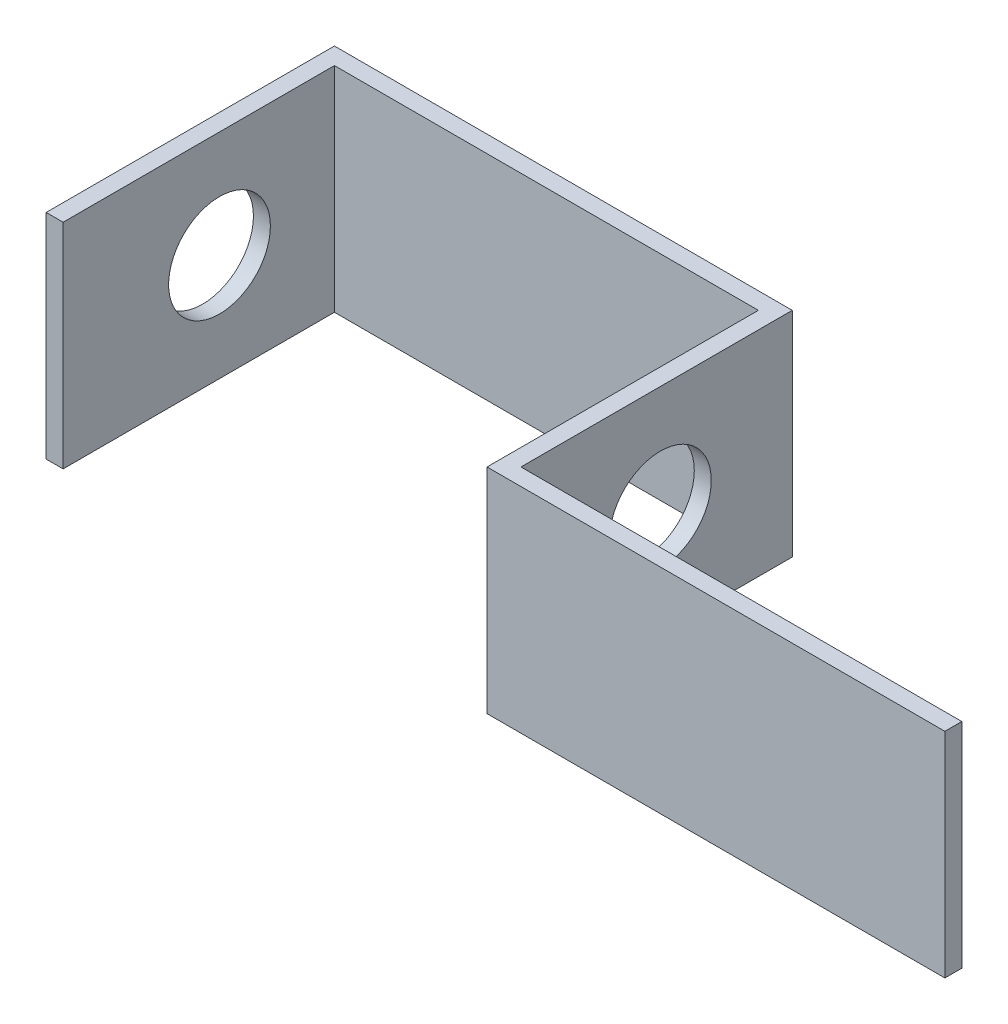
ISO-10303-21;
HEADER;
FILE_DESCRIPTION(('STEP AP214'),'2;1');
FILE_NAME('part.step','',(''),(''),'','','');
FILE_SCHEMA(('AUTOMOTIVE_DESIGN { 1 0 10303 214 1 1 1 1 }'));
ENDSEC;
DATA;
#1=APPLICATION_CONTEXT('core data for automotive mechanical design processes');
#2=APPLICATION_PROTOCOL_DEFINITION('international standard','automotive_design',2000,#1);
#3=PRODUCT_CONTEXT('',#1,'mechanical');
#4=PRODUCT('Part','Part','',(#3));
#5=PRODUCT_RELATED_PRODUCT_CATEGORY('part','',(#4));
#6=PRODUCT_DEFINITION_FORMATION('','',#4);
#7=PRODUCT_DEFINITION_CONTEXT('part definition',#1,'design');
#8=PRODUCT_DEFINITION('design','',#6,#7);
#9=PRODUCT_DEFINITION_SHAPE('','',#8);
#10=(LENGTH_UNIT() NAMED_UNIT(*) SI_UNIT(.MILLI.,.METRE.));
#11=(NAMED_UNIT(*) PLANE_ANGLE_UNIT() SI_UNIT($,.RADIAN.));
#12=(NAMED_UNIT(*) SI_UNIT($,.STERADIAN.) SOLID_ANGLE_UNIT());
#13=UNCERTAINTY_MEASURE_WITH_UNIT(LENGTH_MEASURE(1.E-05),#10,'distance_accuracy_value','');
#14=(GEOMETRIC_REPRESENTATION_CONTEXT(3) GLOBAL_UNCERTAINTY_ASSIGNED_CONTEXT((#13)) GLOBAL_UNIT_ASSIGNED_CONTEXT((#10,
#11,#12)) REPRESENTATION_CONTEXT('',''));
#15=CARTESIAN_POINT('',(0.,0.,0.));
#16=DIRECTION('',(0.,0.,1.));
#17=DIRECTION('',(1.,0.,0.));
#18=AXIS2_PLACEMENT_3D('',#15,#16,#17);
#19=CARTESIAN_POINT('',(-85.725,80.01,6.35000000000002));
#20=DIRECTION('',(1.,0.,0.));
#21=DIRECTION('',(0.,0.,-1.));
#22=AXIS2_PLACEMENT_3D('',#19,#20,#21);
#23=PLANE('',#22);
#24=CARTESIAN_POINT('',(-85.725,40.0049999999999,-52.2149045313785));
#25=DIRECTION('',(1.,0.,0.));
#26=DIRECTION('',(0.,0.,-1.));
#27=AXIS2_PLACEMENT_3D('',#24,#25,#26);
#28=CIRCLE('',#27,19.05);
#29=CARTESIAN_POINT('',(-85.725,40.0049999999999,-71.2649045313785));
#30=VERTEX_POINT('',#29);
#31=EDGE_CURVE('E151',#30,#30,#28,.T.);
#32=ORIENTED_EDGE('',*,*,#31,.T.);
#33=EDGE_LOOP('',(#32));
#34=FACE_BOUND('',#33,.T.);
#35=DIRECTION('',(0.,0.,1.));
#36=VECTOR('',#35,1.);
#37=CARTESIAN_POINT('',(-85.725,0.,6.35000000000002));
#38=LINE('',#37,#36);
#39=CARTESIAN_POINT('',(-85.725,0.,-101.6));
#40=VERTEX_POINT('',#39);
#41=CARTESIAN_POINT('',(-85.725,0.,6.35000000000002));
#42=VERTEX_POINT('',#41);
#43=EDGE_CURVE('E147',#40,#42,#38,.T.);
#44=ORIENTED_EDGE('',*,*,#43,.T.);
#45=DIRECTION('',(0.,-1.,0.));
#46=VECTOR('',#45,1.);
#47=CARTESIAN_POINT('',(-85.725,80.01,6.35000000000002));
#48=LINE('',#47,#46);
#49=CARTESIAN_POINT('',(-85.725,80.01,6.35000000000002));
#50=VERTEX_POINT('',#49);
#51=EDGE_CURVE('E11',#50,#42,#48,.T.);
#52=ORIENTED_EDGE('',*,*,#51,.F.);
#53=DIRECTION('',(0.,0.,1.));
#54=VECTOR('',#53,1.);
#55=CARTESIAN_POINT('',(-85.725,80.01,6.35000000000002));
#56=LINE('',#55,#54);
#57=CARTESIAN_POINT('',(-85.725,80.01,-101.6));
#58=VERTEX_POINT('',#57);
#59=EDGE_CURVE('E167',#58,#50,#56,.T.);
#60=ORIENTED_EDGE('',*,*,#59,.F.);
#61=DIRECTION('',(0.,-1.,0.));
#62=VECTOR('',#61,1.);
#63=CARTESIAN_POINT('',(-85.725,80.01,-101.6));
#64=LINE('',#63,#62);
#65=EDGE_CURVE('E143',#58,#40,#64,.T.);
#66=ORIENTED_EDGE('',*,*,#65,.T.);
#67=EDGE_LOOP('',(#44,#52,#60,#66));
#68=FACE_BOUND('',#67,.T.);
#69=ADVANCED_FACE('F39',(#34,#68),#23,.F.);
#70=CARTESIAN_POINT('',(-79.375,80.01,6.35000000000002));
#71=DIRECTION('',(0.,0.,-1.));
#72=DIRECTION('',(-1.,0.,0.));
#73=AXIS2_PLACEMENT_3D('',#70,#71,#72);
#74=PLANE('',#73);
#75=DIRECTION('',(1.,0.,0.));
#76=VECTOR('',#75,1.);
#77=CARTESIAN_POINT('',(-79.375,0.,6.35000000000002));
#78=LINE('',#77,#76);
#79=CARTESIAN_POINT('',(-79.375,0.,6.35000000000002));
#80=VERTEX_POINT('',#79);
#81=EDGE_CURVE('E150',#42,#80,#78,.T.);
#82=ORIENTED_EDGE('',*,*,#81,.T.);
#83=DIRECTION('',(0.,-1.,0.));
#84=VECTOR('',#83,1.);
#85=CARTESIAN_POINT('',(-79.375,80.01,6.35000000000002));
#86=LINE('',#85,#84);
#87=CARTESIAN_POINT('',(-79.375,80.01,6.35000000000002));
#88=VERTEX_POINT('',#87);
#89=EDGE_CURVE('E47',#88,#80,#86,.T.);
#90=ORIENTED_EDGE('',*,*,#89,.F.);
#91=DIRECTION('',(1.,0.,0.));
#92=VECTOR('',#91,1.);
#93=CARTESIAN_POINT('',(-79.375,80.01,6.35000000000002));
#94=LINE('',#93,#92);
#95=EDGE_CURVE('E104',#50,#88,#94,.T.);
#96=ORIENTED_EDGE('',*,*,#95,.F.);
#97=ORIENTED_EDGE('',*,*,#51,.T.);
#98=EDGE_LOOP('',(#82,#90,#96,#97));
#99=FACE_BOUND('',#98,.T.);
#100=ADVANCED_FACE('F241',(#99),#74,.F.);
#101=CARTESIAN_POINT('',(-79.375,80.01,-95.25));
#102=DIRECTION('',(-1.,0.,0.));
#103=DIRECTION('',(0.,0.,1.));
#104=AXIS2_PLACEMENT_3D('',#101,#102,#103);
#105=PLANE('',#104);
#106=CARTESIAN_POINT('',(-79.375,40.0049999999999,-52.2149045313785));
#107=DIRECTION('',(-1.,0.,0.));
#108=DIRECTION('',(0.,0.,1.));
#109=AXIS2_PLACEMENT_3D('',#106,#107,#108);
#110=CIRCLE('',#109,19.05);
#111=CARTESIAN_POINT('',(-79.375,40.0049999999999,-71.2649045313785));
#112=VERTEX_POINT('',#111);
#113=EDGE_CURVE('E215',#112,#112,#110,.T.);
#114=ORIENTED_EDGE('',*,*,#113,.T.);
#115=EDGE_LOOP('',(#114));
#116=FACE_BOUND('',#115,.T.);
#117=DIRECTION('',(0.,0.,-1.));
#118=VECTOR('',#117,1.);
#119=CARTESIAN_POINT('',(-79.375,0.,-95.25));
#120=LINE('',#119,#118);
#121=CARTESIAN_POINT('',(-79.375,0.,-95.25));
#122=VERTEX_POINT('',#121);
#123=EDGE_CURVE('E153',#80,#122,#120,.T.);
#124=ORIENTED_EDGE('',*,*,#123,.T.);
#125=DIRECTION('',(0.,-1.,0.));
#126=VECTOR('',#125,1.);
#127=CARTESIAN_POINT('',(-79.375,80.01,-95.25));
#128=LINE('',#127,#126);
#129=CARTESIAN_POINT('',(-79.375,80.01,-95.25));
#130=VERTEX_POINT('',#129);
#131=EDGE_CURVE('E180',#130,#122,#128,.T.);
#132=ORIENTED_EDGE('',*,*,#131,.F.);
#133=DIRECTION('',(0.,0.,-1.));
#134=VECTOR('',#133,1.);
#135=CARTESIAN_POINT('',(-79.375,80.01,-95.25));
#136=LINE('',#135,#134);
#137=EDGE_CURVE('E188',#88,#130,#136,.T.);
#138=ORIENTED_EDGE('',*,*,#137,.F.);
#139=ORIENTED_EDGE('',*,*,#89,.T.);
#140=EDGE_LOOP('',(#124,#132,#138,#139));
#141=FACE_BOUND('',#140,.T.);
#142=ADVANCED_FACE('F186',(#116,#141),#105,.F.);
#143=CARTESIAN_POINT('',(79.375,80.01,-95.25));
#144=DIRECTION('',(0.,0.,-1.));
#145=DIRECTION('',(-1.,0.,0.));
#146=AXIS2_PLACEMENT_3D('',#143,#144,#145);
#147=PLANE('',#146);
#148=DIRECTION('',(1.,0.,0.));
#149=VECTOR('',#148,1.);
#150=CARTESIAN_POINT('',(79.375,0.,-95.25));
#151=LINE('',#150,#149);
#152=CARTESIAN_POINT('',(79.375,0.,-95.25));
#153=VERTEX_POINT('',#152);
#154=EDGE_CURVE('E155',#122,#153,#151,.T.);
#155=ORIENTED_EDGE('',*,*,#154,.T.);
#156=DIRECTION('',(0.,-1.,0.));
#157=VECTOR('',#156,1.);
#158=CARTESIAN_POINT('',(79.375,80.01,-95.25));
#159=LINE('',#158,#157);
#160=CARTESIAN_POINT('',(79.375,80.01,-95.25));
#161=VERTEX_POINT('',#160);
#162=EDGE_CURVE('E177',#161,#153,#159,.T.);
#163=ORIENTED_EDGE('',*,*,#162,.F.);
#164=DIRECTION('',(1.,0.,0.));
#165=VECTOR('',#164,1.);
#166=CARTESIAN_POINT('',(79.375,80.01,-95.25));
#167=LINE('',#166,#165);
#168=EDGE_CURVE('E205',#130,#161,#167,.T.);
#169=ORIENTED_EDGE('',*,*,#168,.F.);
#170=ORIENTED_EDGE('',*,*,#131,.T.);
#171=EDGE_LOOP('',(#155,#163,#169,#170));
#172=FACE_BOUND('',#171,.T.);
#173=ADVANCED_FACE('F196',(#172),#147,.F.);
#174=CARTESIAN_POINT('',(79.375,80.01,-95.25));
#175=DIRECTION('',(1.,0.,0.));
#176=DIRECTION('',(0.,0.,-1.));
#177=AXIS2_PLACEMENT_3D('',#174,#175,#176);
#178=PLANE('',#177);
#179=CARTESIAN_POINT('',(79.375,40.0049999999999,-52.2149045313785));
#180=DIRECTION('',(1.,0.,0.));
#181=DIRECTION('',(0.,0.,-1.));
#182=AXIS2_PLACEMENT_3D('',#179,#180,#181);
#183=CIRCLE('',#182,19.05);
#184=CARTESIAN_POINT('',(79.3749999999999,40.0049999999999,-71.2649045313785));
#185=VERTEX_POINT('',#184);
#186=EDGE_CURVE('E218',#185,#185,#183,.T.);
#187=ORIENTED_EDGE('',*,*,#186,.T.);
#188=EDGE_LOOP('',(#187));
#189=FACE_BOUND('',#188,.T.);
#190=DIRECTION('',(0.,0.,1.));
#191=VECTOR('',#190,1.);
#192=CARTESIAN_POINT('',(79.375,0.,-95.25));
#193=LINE('',#192,#191);
#194=CARTESIAN_POINT('',(79.375,0.,6.35));
#195=VERTEX_POINT('',#194);
#196=EDGE_CURVE('E157',#153,#195,#193,.T.);
#197=ORIENTED_EDGE('',*,*,#196,.T.);
#198=DIRECTION('',(0.,-1.,0.));
#199=VECTOR('',#198,1.);
#200=CARTESIAN_POINT('',(79.375,80.01,6.35));
#201=LINE('',#200,#199);
#202=CARTESIAN_POINT('',(79.375,80.01,6.35));
#203=VERTEX_POINT('',#202);
#204=EDGE_CURVE('E174',#203,#195,#201,.T.);
#205=ORIENTED_EDGE('',*,*,#204,.F.);
#206=DIRECTION('',(0.,0.,1.));
#207=VECTOR('',#206,1.);
#208=CARTESIAN_POINT('',(79.375,80.01,-95.25));
#209=LINE('',#208,#207);
#210=EDGE_CURVE('E202',#161,#203,#209,.T.);
#211=ORIENTED_EDGE('',*,*,#210,.F.);
#212=ORIENTED_EDGE('',*,*,#162,.T.);
#213=EDGE_LOOP('',(#197,#205,#211,#212));
#214=FACE_BOUND('',#213,.T.);
#215=ADVANCED_FACE('F200',(#189,#214),#178,.F.);
#216=CARTESIAN_POINT('',(110.088132220091,80.01,6.34999999999999));
#217=DIRECTION('',(0.,0.,-1.));
#218=DIRECTION('',(-1.,0.,0.));
#219=AXIS2_PLACEMENT_3D('',#216,#217,#218);
#220=PLANE('',#219);
#221=DIRECTION('',(1.,0.,0.));
#222=VECTOR('',#221,1.);
#223=CARTESIAN_POINT('',(110.088132220091,0.,6.34999999999999));
#224=LINE('',#223,#222);
#225=CARTESIAN_POINT('',(250.825,0.,6.34999999999999));
#226=VERTEX_POINT('',#225);
#227=EDGE_CURVE('E160',#195,#226,#224,.T.);
#228=ORIENTED_EDGE('',*,*,#227,.T.);
#229=DIRECTION('',(0.,-1.,0.));
#230=VECTOR('',#229,1.);
#231=CARTESIAN_POINT('',(250.825,80.01,6.34999999999999));
#232=LINE('',#231,#230);
#233=CARTESIAN_POINT('',(250.825,80.01,6.34999999999999));
#234=VERTEX_POINT('',#233);
#235=EDGE_CURVE('E171',#234,#226,#232,.T.);
#236=ORIENTED_EDGE('',*,*,#235,.F.);
#237=DIRECTION('',(1.,0.,0.));
#238=VECTOR('',#237,1.);
#239=CARTESIAN_POINT('',(110.088132220091,80.01,6.34999999999999));
#240=LINE('',#239,#238);
#241=EDGE_CURVE('E204',#203,#234,#240,.T.);
#242=ORIENTED_EDGE('',*,*,#241,.F.);
#243=ORIENTED_EDGE('',*,*,#204,.T.);
#244=EDGE_LOOP('',(#228,#236,#242,#243));
#245=FACE_BOUND('',#244,.T.);
#246=ADVANCED_FACE('F256',(#245),#220,.F.);
#247=CARTESIAN_POINT('',(250.825,80.01,6.34999999999999));
#248=DIRECTION('',(-1.,0.,0.));
#249=DIRECTION('',(0.,0.,1.));
#250=AXIS2_PLACEMENT_3D('',#247,#248,#249);
#251=PLANE('',#250);
#252=DIRECTION('',(0.,0.,-1.));
#253=VECTOR('',#252,1.);
#254=CARTESIAN_POINT('',(250.825,0.,6.34999999999999));
#255=LINE('',#254,#253);
#256=CARTESIAN_POINT('',(250.825,0.,0.));
#257=VERTEX_POINT('',#256);
#258=EDGE_CURVE('E162',#226,#257,#255,.T.);
#259=ORIENTED_EDGE('',*,*,#258,.T.);
#260=DIRECTION('',(0.,-1.,0.));
#261=VECTOR('',#260,1.);
#262=CARTESIAN_POINT('',(250.825,80.01,0.));
#263=LINE('',#262,#261);
#264=CARTESIAN_POINT('',(250.825,80.01,0.));
#265=VERTEX_POINT('',#264);
#266=EDGE_CURVE('E138',#265,#257,#263,.T.);
#267=ORIENTED_EDGE('',*,*,#266,.F.);
#268=DIRECTION('',(0.,0.,-1.));
#269=VECTOR('',#268,1.);
#270=CARTESIAN_POINT('',(250.825,80.01,6.34999999999999));
#271=LINE('',#270,#269);
#272=EDGE_CURVE('E129',#234,#265,#271,.T.);
#273=ORIENTED_EDGE('',*,*,#272,.F.);
#274=ORIENTED_EDGE('',*,*,#235,.T.);
#275=EDGE_LOOP('',(#259,#267,#273,#274));
#276=FACE_BOUND('',#275,.T.);
#277=ADVANCED_FACE('F238',(#276),#251,.F.);
#278=CARTESIAN_POINT('',(250.825,80.01,0.));
#279=DIRECTION('',(0.,0.,1.));
#280=DIRECTION('',(1.,0.,0.));
#281=AXIS2_PLACEMENT_3D('',#278,#279,#280);
#282=PLANE('',#281);
#283=DIRECTION('',(-1.,0.,0.));
#284=VECTOR('',#283,1.);
#285=CARTESIAN_POINT('',(250.825,0.,0.));
#286=LINE('',#285,#284);
#287=CARTESIAN_POINT('',(85.725,0.,0.));
#288=VERTEX_POINT('',#287);
#289=EDGE_CURVE('E137',#257,#288,#286,.T.);
#290=ORIENTED_EDGE('',*,*,#289,.T.);
#291=DIRECTION('',(0.,-1.,0.));
#292=VECTOR('',#291,1.);
#293=CARTESIAN_POINT('',(85.725,80.01,0.));
#294=LINE('',#293,#292);
#295=CARTESIAN_POINT('',(85.725,80.01,0.));
#296=VERTEX_POINT('',#295);
#297=EDGE_CURVE('E134',#296,#288,#294,.T.);
#298=ORIENTED_EDGE('',*,*,#297,.F.);
#299=DIRECTION('',(-1.,0.,0.));
#300=VECTOR('',#299,1.);
#301=CARTESIAN_POINT('',(250.825,80.01,0.));
#302=LINE('',#301,#300);
#303=EDGE_CURVE('E123',#265,#296,#302,.T.);
#304=ORIENTED_EDGE('',*,*,#303,.F.);
#305=ORIENTED_EDGE('',*,*,#266,.T.);
#306=EDGE_LOOP('',(#290,#298,#304,#305));
#307=FACE_BOUND('',#306,.T.);
#308=ADVANCED_FACE('F135',(#307),#282,.F.);
#309=CARTESIAN_POINT('',(85.725,80.01,0.));
#310=DIRECTION('',(-1.,0.,0.));
#311=DIRECTION('',(0.,0.,1.));
#312=AXIS2_PLACEMENT_3D('',#309,#310,#311);
#313=PLANE('',#312);
#314=CARTESIAN_POINT('',(85.725,40.0049999999999,-52.2149045313785));
#315=DIRECTION('',(1.,0.,0.));
#316=DIRECTION('',(0.,0.,-1.));
#317=AXIS2_PLACEMENT_3D('',#314,#315,#316);
#318=CIRCLE('',#317,19.05);
#319=CARTESIAN_POINT('',(85.725,40.0049999999999,-71.2649045313785));
#320=VERTEX_POINT('',#319);
#321=EDGE_CURVE('E221',#320,#320,#318,.T.);
#322=ORIENTED_EDGE('',*,*,#321,.F.);
#323=EDGE_LOOP('',(#322));
#324=FACE_BOUND('',#323,.T.);
#325=DIRECTION('',(0.,0.,-1.));
#326=VECTOR('',#325,1.);
#327=CARTESIAN_POINT('',(85.725,0.,0.));
#328=LINE('',#327,#326);
#329=CARTESIAN_POINT('',(85.725,0.,-101.6));
#330=VERTEX_POINT('',#329);
#331=EDGE_CURVE('E90',#288,#330,#328,.T.);
#332=ORIENTED_EDGE('',*,*,#331,.T.);
#333=DIRECTION('',(0.,-1.,0.));
#334=VECTOR('',#333,1.);
#335=CARTESIAN_POINT('',(85.725,80.01,-101.6));
#336=LINE('',#335,#334);
#337=CARTESIAN_POINT('',(85.725,80.01,-101.6));
#338=VERTEX_POINT('',#337);
#339=EDGE_CURVE('E139',#338,#330,#336,.T.);
#340=ORIENTED_EDGE('',*,*,#339,.F.);
#341=DIRECTION('',(0.,0.,-1.));
#342=VECTOR('',#341,1.);
#343=CARTESIAN_POINT('',(85.725,80.01,0.));
#344=LINE('',#343,#342);
#345=EDGE_CURVE('E127',#296,#338,#344,.T.);
#346=ORIENTED_EDGE('',*,*,#345,.F.);
#347=ORIENTED_EDGE('',*,*,#297,.T.);
#348=EDGE_LOOP('',(#332,#340,#346,#347));
#349=FACE_BOUND('',#348,.T.);
#350=ADVANCED_FACE('F141',(#324,#349),#313,.F.);
#351=CARTESIAN_POINT('',(85.725,80.01,-101.6));
#352=DIRECTION('',(0.,0.,1.));
#353=DIRECTION('',(1.,0.,0.));
#354=AXIS2_PLACEMENT_3D('',#351,#352,#353);
#355=PLANE('',#354);
#356=DIRECTION('',(-1.,0.,0.));
#357=VECTOR('',#356,1.);
#358=CARTESIAN_POINT('',(85.725,0.,-101.6));
#359=LINE('',#358,#357);
#360=EDGE_CURVE('E96',#330,#40,#359,.T.);
#361=ORIENTED_EDGE('',*,*,#360,.T.);
#362=ORIENTED_EDGE('',*,*,#65,.F.);
#363=DIRECTION('',(-1.,0.,0.));
#364=VECTOR('',#363,1.);
#365=CARTESIAN_POINT('',(85.725,80.01,-101.6));
#366=LINE('',#365,#364);
#367=EDGE_CURVE('E55',#338,#58,#366,.T.);
#368=ORIENTED_EDGE('',*,*,#367,.F.);
#369=ORIENTED_EDGE('',*,*,#339,.T.);
#370=EDGE_LOOP('',(#361,#362,#368,#369));
#371=FACE_BOUND('',#370,.T.);
#372=ADVANCED_FACE('F229',(#371),#355,.F.);
#373=CARTESIAN_POINT('',(0.,80.01,0.));
#374=DIRECTION('',(0.,1.,0.));
#375=DIRECTION('',(0.,0.,1.));
#376=AXIS2_PLACEMENT_3D('',#373,#374,#375);
#377=PLANE('',#376);
#378=ORIENTED_EDGE('',*,*,#59,.T.);
#379=ORIENTED_EDGE('',*,*,#95,.T.);
#380=ORIENTED_EDGE('',*,*,#137,.T.);
#381=ORIENTED_EDGE('',*,*,#168,.T.);
#382=ORIENTED_EDGE('',*,*,#210,.T.);
#383=ORIENTED_EDGE('',*,*,#241,.T.);
#384=ORIENTED_EDGE('',*,*,#272,.T.);
#385=ORIENTED_EDGE('',*,*,#303,.T.);
#386=ORIENTED_EDGE('',*,*,#345,.T.);
#387=ORIENTED_EDGE('',*,*,#367,.T.);
#388=EDGE_LOOP('',(#378,#379,#380,#381,#382,#383,#384,#385,#386,#387));
#389=FACE_BOUND('',#388,.T.);
#390=ADVANCED_FACE('F125',(#389),#377,.T.);
#391=CARTESIAN_POINT('',(0.,0.,0.));
#392=DIRECTION('',(0.,1.,0.));
#393=DIRECTION('',(0.,0.,1.));
#394=AXIS2_PLACEMENT_3D('',#391,#392,#393);
#395=PLANE('',#394);
#396=ORIENTED_EDGE('',*,*,#43,.F.);
#397=ORIENTED_EDGE('',*,*,#360,.F.);
#398=ORIENTED_EDGE('',*,*,#331,.F.);
#399=ORIENTED_EDGE('',*,*,#289,.F.);
#400=ORIENTED_EDGE('',*,*,#258,.F.);
#401=ORIENTED_EDGE('',*,*,#227,.F.);
#402=ORIENTED_EDGE('',*,*,#196,.F.);
#403=ORIENTED_EDGE('',*,*,#154,.F.);
#404=ORIENTED_EDGE('',*,*,#123,.F.);
#405=ORIENTED_EDGE('',*,*,#81,.F.);
#406=EDGE_LOOP('',(#396,#397,#398,#399,#400,#401,#402,#403,#404,#405));
#407=FACE_BOUND('',#406,.T.);
#408=ADVANCED_FACE('F192',(#407),#395,.F.);
#409=CARTESIAN_POINT('',(-90.0430000000001,40.0049999999999,-52.2149045313785));
#410=DIRECTION('',(1.,0.,0.));
#411=DIRECTION('',(0.,0.,-1.));
#412=AXIS2_PLACEMENT_3D('',#409,#410,#411);
#413=CYLINDRICAL_SURFACE('',#412,19.05);
#414=CARTESIAN_POINT('',(85.725,40.0049999999999,-71.2649045313785));
#415=CARTESIAN_POINT('',(85.6588541666667,40.0049999999999,-71.2649045313785));
#416=CARTESIAN_POINT('',(85.5927083333333,40.0049999999999,-71.2649045313785));
#417=CARTESIAN_POINT('',(85.4604166666667,40.0049999999999,-71.2649045313785));
#418=CARTESIAN_POINT('',(85.3942708333333,40.0049999999999,-71.2649045313785));
#419=CARTESIAN_POINT('',(85.2619791666667,40.0049999999999,-71.2649045313785));
#420=CARTESIAN_POINT('',(85.1958333333333,40.0049999999999,-71.2649045313785));
#421=CARTESIAN_POINT('',(85.0635416666667,40.0049999999999,-71.2649045313785));
#422=CARTESIAN_POINT('',(84.9973958333333,40.0049999999999,-71.2649045313785));
#423=CARTESIAN_POINT('',(84.8651041666667,40.0049999999999,-71.2649045313785));
#424=CARTESIAN_POINT('',(84.7989583333333,40.0049999999999,-71.2649045313785));
#425=CARTESIAN_POINT('',(84.6666666666667,40.0049999999999,-71.2649045313785));
#426=CARTESIAN_POINT('',(84.6005208333333,40.0049999999999,-71.2649045313785));
#427=CARTESIAN_POINT('',(84.4682291666667,40.0049999999999,-71.2649045313785));
#428=CARTESIAN_POINT('',(84.4020833333333,40.0049999999999,-71.2649045313785));
#429=CARTESIAN_POINT('',(84.2697916666667,40.0049999999999,-71.2649045313785));
#430=CARTESIAN_POINT('',(84.2036458333333,40.0049999999999,-71.2649045313785));
#431=CARTESIAN_POINT('',(84.0713541666667,40.0049999999999,-71.2649045313785));
#432=CARTESIAN_POINT('',(84.0052083333333,40.0049999999999,-71.2649045313785));
#433=CARTESIAN_POINT('',(83.8729166666666,40.0049999999999,-71.2649045313785));
#434=CARTESIAN_POINT('',(83.8067708333333,40.0049999999999,-71.2649045313785));
#435=CARTESIAN_POINT('',(83.6744791666666,40.0049999999999,-71.2649045313785));
#436=CARTESIAN_POINT('',(83.6083333333333,40.0049999999999,-71.2649045313785));
#437=CARTESIAN_POINT('',(83.4760416666667,40.0049999999999,-71.2649045313785));
#438=CARTESIAN_POINT('',(83.4098958333333,40.0049999999999,-71.2649045313785));
#439=CARTESIAN_POINT('',(83.2776041666666,40.0049999999999,-71.2649045313785));
#440=CARTESIAN_POINT('',(83.2114583333333,40.0049999999999,-71.2649045313785));
#441=CARTESIAN_POINT('',(83.0791666666667,40.0049999999999,-71.2649045313785));
#442=CARTESIAN_POINT('',(83.0130208333333,40.0049999999999,-71.2649045313785));
#443=CARTESIAN_POINT('',(82.8807291666667,40.0049999999999,-71.2649045313785));
#444=CARTESIAN_POINT('',(82.8145833333333,40.0049999999999,-71.2649045313785));
#445=CARTESIAN_POINT('',(82.6822916666666,40.0049999999999,-71.2649045313785));
#446=CARTESIAN_POINT('',(82.6161458333333,40.0049999999999,-71.2649045313785));
#447=CARTESIAN_POINT('',(82.4838541666666,40.0049999999999,-71.2649045313785));
#448=CARTESIAN_POINT('',(82.4177083333333,40.0049999999999,-71.2649045313785));
#449=CARTESIAN_POINT('',(82.2854166666666,40.0049999999999,-71.2649045313785));
#450=CARTESIAN_POINT('',(82.2192708333333,40.0049999999999,-71.2649045313785));
#451=CARTESIAN_POINT('',(82.0869791666666,40.0049999999999,-71.2649045313785));
#452=CARTESIAN_POINT('',(82.0208333333333,40.0049999999999,-71.2649045313785));
#453=CARTESIAN_POINT('',(81.8885416666666,40.0049999999999,-71.2649045313785));
#454=CARTESIAN_POINT('',(81.8223958333333,40.0049999999999,-71.2649045313785));
#455=CARTESIAN_POINT('',(81.6901041666666,40.0049999999999,-71.2649045313785));
#456=CARTESIAN_POINT('',(81.6239583333333,40.0049999999999,-71.2649045313785));
#457=CARTESIAN_POINT('',(81.4916666666666,40.0049999999999,-71.2649045313785));
#458=CARTESIAN_POINT('',(81.4255208333333,40.0049999999999,-71.2649045313785));
#459=CARTESIAN_POINT('',(81.2932291666666,40.0049999999999,-71.2649045313785));
#460=CARTESIAN_POINT('',(81.2270833333333,40.0049999999999,-71.2649045313785));
#461=CARTESIAN_POINT('',(81.0947916666666,40.0049999999999,-71.2649045313785));
#462=CARTESIAN_POINT('',(81.0286458333333,40.0049999999999,-71.2649045313785));
#463=CARTESIAN_POINT('',(80.8963541666666,40.0049999999999,-71.2649045313785));
#464=CARTESIAN_POINT('',(80.8302083333333,40.0049999999999,-71.2649045313785));
#465=CARTESIAN_POINT('',(80.6979166666666,40.0049999999999,-71.2649045313785));
#466=CARTESIAN_POINT('',(80.6317708333333,40.0049999999999,-71.2649045313785));
#467=CARTESIAN_POINT('',(80.4994791666666,40.0049999999999,-71.2649045313785));
#468=CARTESIAN_POINT('',(80.4333333333333,40.0049999999999,-71.2649045313785));
#469=CARTESIAN_POINT('',(80.3010416666666,40.0049999999999,-71.2649045313785));
#470=CARTESIAN_POINT('',(80.2348958333333,40.0049999999999,-71.2649045313785));
#471=CARTESIAN_POINT('',(80.1026041666666,40.0049999999999,-71.2649045313785));
#472=CARTESIAN_POINT('',(80.0364583333333,40.0049999999999,-71.2649045313785));
#473=CARTESIAN_POINT('',(79.9041666666666,40.0049999999999,-71.2649045313785));
#474=CARTESIAN_POINT('',(79.8380208333333,40.0049999999999,-71.2649045313785));
#475=CARTESIAN_POINT('',(79.7057291666666,40.0049999999999,-71.2649045313785));
#476=CARTESIAN_POINT('',(79.6395833333333,40.0049999999999,-71.2649045313785));
#477=CARTESIAN_POINT('',(79.5072916666666,40.0049999999999,-71.2649045313785));
#478=CARTESIAN_POINT('',(79.4411458333333,40.0049999999999,-71.2649045313785));
#479=CARTESIAN_POINT('',(79.3749999999999,40.0049999999999,-71.2649045313785));
#480=B_SPLINE_CURVE_WITH_KNOTS('',3,(#414,#415,#416,#417,#418,#419,#420,#421,#422,#423,#424,
#425,#426,#427,#428,#429,#430,#431,#432,#433,#434,#435,#436,#437,#438,#439,#440,#441,#442,#443,
#444,#445,#446,#447,#448,#449,#450,#451,#452,#453,#454,#455,#456,#457,#458,#459,#460,#461,#462,
#463,#464,#465,#466,#467,#468,#469,#470,#471,#472,#473,#474,#475,#476,#477,#478,#479),
.UNSPECIFIED.,.F.,.F.,(4,2,2,2,2,2,2,2,2,2,2,2,2,2,2,2,2,2,2,2,2,2,2,2,2,2,2,2,2,2,2,2,4),(0.,
0.198437500000009,0.396875000000019,0.5953125,0.79375000000001,0.992187500000019,1.190625,
1.38906250000001,1.58750000000002,1.78593750000003,1.98437500000004,2.18281250000002,
2.38125000000003,2.57968750000004,2.77812500000002,2.97656250000003,3.17500000000004,
3.37343750000005,3.57187500000006,3.77031250000004,3.96875000000005,4.16718750000006,
4.36562500000004,4.56406250000005,4.76250000000006,4.96093750000007,5.15937500000008,
5.35781250000006,5.55625000000007,5.75468750000008,5.95312500000006,6.15156250000007,
6.35000000000008),.UNSPECIFIED.);
#481=EDGE_CURVE('BSEAM225',#320,#185,#480,.T.);
#482=ORIENTED_EDGE('',*,*,#321,.T.);
#483=ORIENTED_EDGE('',*,*,#186,.F.);
#484=ORIENTED_EDGE('',*,*,#481,.T.);
#485=ORIENTED_EDGE('',*,*,#481,.F.);
#486=EDGE_LOOP('',(#482,#484,#483,#485));
#487=FACE_BOUND('',#486,.T.);
#488=ADVANCED_FACE('F225',(#487),#413,.F.);
#489=CARTESIAN_POINT('',(-79.375,40.0049999999999,-71.2649045313785));
#490=CARTESIAN_POINT('',(-79.4411458333334,40.0049999999999,-71.2649045313785));
#491=CARTESIAN_POINT('',(-79.5072916666667,40.0049999999999,-71.2649045313785));
#492=CARTESIAN_POINT('',(-79.6395833333334,40.0049999999999,-71.2649045313785));
#493=CARTESIAN_POINT('',(-79.7057291666667,40.0049999999999,-71.2649045313785));
#494=CARTESIAN_POINT('',(-79.8380208333334,40.0049999999999,-71.2649045313785));
#495=CARTESIAN_POINT('',(-79.9041666666667,40.0049999999999,-71.2649045313785));
#496=CARTESIAN_POINT('',(-80.0364583333334,40.0049999999999,-71.2649045313785));
#497=CARTESIAN_POINT('',(-80.1026041666667,40.0049999999999,-71.2649045313785));
#498=CARTESIAN_POINT('',(-80.2348958333334,40.0049999999999,-71.2649045313785));
#499=CARTESIAN_POINT('',(-80.3010416666667,40.0049999999999,-71.2649045313785));
#500=CARTESIAN_POINT('',(-80.4333333333334,40.0049999999999,-71.2649045313785));
#501=CARTESIAN_POINT('',(-80.4994791666667,40.0049999999999,-71.2649045313785));
#502=CARTESIAN_POINT('',(-80.6317708333333,40.0049999999999,-71.2649045313785));
#503=CARTESIAN_POINT('',(-80.6979166666667,40.0049999999999,-71.2649045313785));
#504=CARTESIAN_POINT('',(-80.8302083333334,40.0049999999999,-71.2649045313785));
#505=CARTESIAN_POINT('',(-80.8963541666667,40.0049999999999,-71.2649045313785));
#506=CARTESIAN_POINT('',(-81.0286458333334,40.0049999999999,-71.2649045313785));
#507=CARTESIAN_POINT('',(-81.0947916666667,40.0049999999999,-71.2649045313785));
#508=CARTESIAN_POINT('',(-81.2270833333334,40.0049999999999,-71.2649045313785));
#509=CARTESIAN_POINT('',(-81.2932291666667,40.0049999999999,-71.2649045313785));
#510=CARTESIAN_POINT('',(-81.4255208333334,40.0049999999999,-71.2649045313785));
#511=CARTESIAN_POINT('',(-81.4916666666667,40.0049999999999,-71.2649045313785));
#512=CARTESIAN_POINT('',(-81.6239583333334,40.0049999999999,-71.2649045313785));
#513=CARTESIAN_POINT('',(-81.6901041666667,40.0049999999999,-71.2649045313785));
#514=CARTESIAN_POINT('',(-81.8223958333334,40.0049999999999,-71.2649045313785));
#515=CARTESIAN_POINT('',(-81.8885416666667,40.0049999999999,-71.2649045313785));
#516=CARTESIAN_POINT('',(-82.0208333333333,40.0049999999999,-71.2649045313785));
#517=CARTESIAN_POINT('',(-82.0869791666667,40.0049999999999,-71.2649045313785));
#518=CARTESIAN_POINT('',(-82.2192708333334,40.0049999999999,-71.2649045313785));
#519=CARTESIAN_POINT('',(-82.2854166666667,40.0049999999999,-71.2649045313785));
#520=CARTESIAN_POINT('',(-82.4177083333334,40.0049999999999,-71.2649045313785));
#521=CARTESIAN_POINT('',(-82.4838541666667,40.0049999999999,-71.2649045313785));
#522=CARTESIAN_POINT('',(-82.6161458333333,40.0049999999999,-71.2649045313785));
#523=CARTESIAN_POINT('',(-82.6822916666667,40.0049999999999,-71.2649045313785));
#524=CARTESIAN_POINT('',(-82.8145833333334,40.0049999999999,-71.2649045313785));
#525=CARTESIAN_POINT('',(-82.8807291666667,40.0049999999999,-71.2649045313785));
#526=CARTESIAN_POINT('',(-83.0130208333334,40.0049999999999,-71.2649045313785));
#527=CARTESIAN_POINT('',(-83.0791666666667,40.0049999999999,-71.2649045313785));
#528=CARTESIAN_POINT('',(-83.2114583333334,40.0049999999999,-71.2649045313785));
#529=CARTESIAN_POINT('',(-83.2776041666667,40.0049999999999,-71.2649045313785));
#530=CARTESIAN_POINT('',(-83.4098958333334,40.0049999999999,-71.2649045313785));
#531=CARTESIAN_POINT('',(-83.4760416666667,40.0049999999999,-71.2649045313785));
#532=CARTESIAN_POINT('',(-83.6083333333333,40.0049999999999,-71.2649045313785));
#533=CARTESIAN_POINT('',(-83.6744791666667,40.0049999999999,-71.2649045313785));
#534=CARTESIAN_POINT('',(-83.8067708333333,40.0049999999999,-71.2649045313785));
#535=CARTESIAN_POINT('',(-83.8729166666667,40.0049999999999,-71.2649045313785));
#536=CARTESIAN_POINT('',(-84.0052083333334,40.0049999999999,-71.2649045313785));
#537=CARTESIAN_POINT('',(-84.0713541666667,40.0049999999999,-71.2649045313785));
#538=CARTESIAN_POINT('',(-84.2036458333334,40.0049999999999,-71.2649045313785));
#539=CARTESIAN_POINT('',(-84.2697916666667,40.0049999999999,-71.2649045313785));
#540=CARTESIAN_POINT('',(-84.4020833333334,40.0049999999999,-71.2649045313785));
#541=CARTESIAN_POINT('',(-84.4682291666667,40.0049999999999,-71.2649045313785));
#542=CARTESIAN_POINT('',(-84.6005208333334,40.0049999999999,-71.2649045313785));
#543=CARTESIAN_POINT('',(-84.6666666666667,40.0049999999999,-71.2649045313785));
#544=CARTESIAN_POINT('',(-84.7989583333334,40.0049999999999,-71.2649045313785));
#545=CARTESIAN_POINT('',(-84.8651041666667,40.0049999999999,-71.2649045313785));
#546=CARTESIAN_POINT('',(-84.9973958333334,40.0049999999999,-71.2649045313785));
#547=CARTESIAN_POINT('',(-85.0635416666667,40.0049999999999,-71.2649045313785));
#548=CARTESIAN_POINT('',(-85.1958333333334,40.0049999999999,-71.2649045313785));
#549=CARTESIAN_POINT('',(-85.2619791666667,40.0049999999999,-71.2649045313785));
#550=CARTESIAN_POINT('',(-85.3942708333334,40.0049999999999,-71.2649045313785));
#551=CARTESIAN_POINT('',(-85.4604166666667,40.0049999999999,-71.2649045313785));
#552=CARTESIAN_POINT('',(-85.5927083333333,40.0049999999999,-71.2649045313785));
#553=CARTESIAN_POINT('',(-85.6588541666667,40.0049999999999,-71.2649045313785));
#554=CARTESIAN_POINT('',(-85.725,40.0049999999999,-71.2649045313785));
#555=B_SPLINE_CURVE_WITH_KNOTS('',3,(#489,#490,#491,#492,#493,#494,#495,#496,#497,#498,#499,
#500,#501,#502,#503,#504,#505,#506,#507,#508,#509,#510,#511,#512,#513,#514,#515,#516,#517,#518,
#519,#520,#521,#522,#523,#524,#525,#526,#527,#528,#529,#530,#531,#532,#533,#534,#535,#536,#537,
#538,#539,#540,#541,#542,#543,#544,#545,#546,#547,#548,#549,#550,#551,#552,#553,#554),
.UNSPECIFIED.,.F.,.F.,(4,2,2,2,2,2,2,2,2,2,2,2,2,2,2,2,2,2,2,2,2,2,2,2,2,2,2,2,2,2,2,2,4),(0.,
0.198437500000009,0.396875000000005,0.5953125,0.79375000000001,0.992187500000005,1.190625,
1.38906250000001,1.58750000000001,1.7859375,1.984375,2.18281250000001,2.38125,2.5796875,
2.77812500000001,2.9765625,3.175,3.37343750000001,3.571875,3.7703125,3.96875000000001,4.1671875,
4.365625,4.56406250000001,4.7625,4.9609375,5.15937500000001,5.3578125,5.55625,5.75468750000001,
5.953125,6.1515625,6.34999999999999),.UNSPECIFIED.);
#556=EDGE_CURVE('BSEAM273',#112,#30,#555,.T.);
#557=ORIENTED_EDGE('',*,*,#113,.F.);
#558=ORIENTED_EDGE('',*,*,#31,.F.);
#559=ORIENTED_EDGE('',*,*,#556,.T.);
#560=ORIENTED_EDGE('',*,*,#556,.F.);
#561=EDGE_LOOP('',(#557,#559,#558,#560));
#562=FACE_BOUND('',#561,.T.);
#563=ADVANCED_FACE('F273',(#562),#413,.F.);
#564=CLOSED_SHELL('',(#69,#100,#142,#173,#215,#246,#277,#308,#350,#372,#390,#408,#488,#563));
#565=MANIFOLD_SOLID_BREP('B2',#564);
#566=ADVANCED_BREP_SHAPE_REPRESENTATION('',(#18,#565),#14);
#567=SHAPE_DEFINITION_REPRESENTATION(#9,#566);
ENDSEC;
END-ISO-10303-21;
